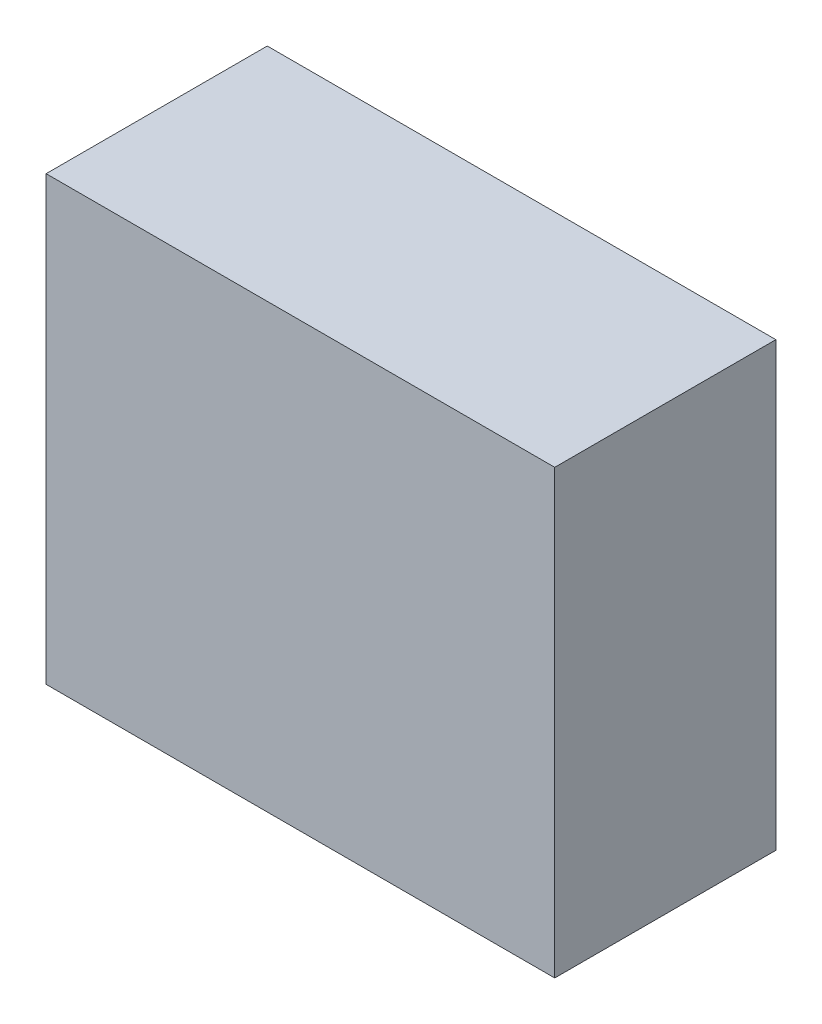
ISO-10303-21;
HEADER;
FILE_DESCRIPTION(('STEP AP214'),'2;1');
FILE_NAME('part.step','',(''),(''),'','','');
FILE_SCHEMA(('AUTOMOTIVE_DESIGN { 1 0 10303 214 1 1 1 1 }'));
ENDSEC;
DATA;
#1=APPLICATION_CONTEXT('core data for automotive mechanical design processes');
#2=APPLICATION_PROTOCOL_DEFINITION('international standard','automotive_design',2000,#1);
#3=PRODUCT_CONTEXT('',#1,'mechanical');
#4=PRODUCT('Part','Part','',(#3));
#5=PRODUCT_RELATED_PRODUCT_CATEGORY('part','',(#4));
#6=PRODUCT_DEFINITION_FORMATION('','',#4);
#7=PRODUCT_DEFINITION_CONTEXT('part definition',#1,'design');
#8=PRODUCT_DEFINITION('design','',#6,#7);
#9=PRODUCT_DEFINITION_SHAPE('','',#8);
#10=(LENGTH_UNIT() NAMED_UNIT(*) SI_UNIT(.MILLI.,.METRE.));
#11=(NAMED_UNIT(*) PLANE_ANGLE_UNIT() SI_UNIT($,.RADIAN.));
#12=(NAMED_UNIT(*) SI_UNIT($,.STERADIAN.) SOLID_ANGLE_UNIT());
#13=UNCERTAINTY_MEASURE_WITH_UNIT(LENGTH_MEASURE(1.E-05),#10,'distance_accuracy_value','');
#14=(GEOMETRIC_REPRESENTATION_CONTEXT(3) GLOBAL_UNCERTAINTY_ASSIGNED_CONTEXT((#13)) GLOBAL_UNIT_ASSIGNED_CONTEXT((#10,
#11,#12)) REPRESENTATION_CONTEXT('',''));
#15=CARTESIAN_POINT('',(0.,0.,0.));
#16=DIRECTION('',(0.,0.,1.));
#17=DIRECTION('',(1.,0.,0.));
#18=AXIS2_PLACEMENT_3D('',#15,#16,#17);
#19=CARTESIAN_POINT('',(0.,0.,-10.));
#20=DIRECTION('',(-1.,0.,0.));
#21=DIRECTION('',(0.,0.,1.));
#22=AXIS2_PLACEMENT_3D('',#19,#20,#21);
#23=PLANE('',#22);
#24=DIRECTION('',(0.,-1.,0.));
#25=VECTOR('',#24,1.);
#26=CARTESIAN_POINT('',(0.,0.,0.));
#27=LINE('',#26,#25);
#28=CARTESIAN_POINT('',(0.,20.,0.));
#29=VERTEX_POINT('',#28);
#30=CARTESIAN_POINT('',(0.,0.,0.));
#31=VERTEX_POINT('',#30);
#32=EDGE_CURVE('E107',#29,#31,#27,.T.);
#33=ORIENTED_EDGE('',*,*,#32,.F.);
#34=DIRECTION('',(0.,0.,1.));
#35=VECTOR('',#34,1.);
#36=CARTESIAN_POINT('',(0.,20.,-10.));
#37=LINE('',#36,#35);
#38=CARTESIAN_POINT('',(0.,20.,-10.));
#39=VERTEX_POINT('',#38);
#40=EDGE_CURVE('E11',#39,#29,#37,.T.);
#41=ORIENTED_EDGE('',*,*,#40,.F.);
#42=DIRECTION('',(0.,-1.,0.));
#43=VECTOR('',#42,1.);
#44=CARTESIAN_POINT('',(0.,0.,-10.));
#45=LINE('',#44,#43);
#46=CARTESIAN_POINT('',(0.,0.,-10.));
#47=VERTEX_POINT('',#46);
#48=EDGE_CURVE('E102',#39,#47,#45,.T.);
#49=ORIENTED_EDGE('',*,*,#48,.T.);
#50=DIRECTION('',(0.,0.,1.));
#51=VECTOR('',#50,1.);
#52=CARTESIAN_POINT('',(0.,0.,-10.));
#53=LINE('',#52,#51);
#54=EDGE_CURVE('E46',#47,#31,#53,.T.);
#55=ORIENTED_EDGE('',*,*,#54,.T.);
#56=EDGE_LOOP('',(#33,#41,#49,#55));
#57=FACE_BOUND('',#56,.T.);
#58=ADVANCED_FACE('F43',(#57),#23,.T.);
#59=CARTESIAN_POINT('',(0.,20.,-10.));
#60=DIRECTION('',(0.,1.,0.));
#61=DIRECTION('',(0.,0.,1.));
#62=AXIS2_PLACEMENT_3D('',#59,#60,#61);
#63=PLANE('',#62);
#64=DIRECTION('',(-1.,0.,0.));
#65=VECTOR('',#64,1.);
#66=CARTESIAN_POINT('',(0.,20.,0.));
#67=LINE('',#66,#65);
#68=CARTESIAN_POINT('',(23.,20.,0.));
#69=VERTEX_POINT('',#68);
#70=EDGE_CURVE('E104',#69,#29,#67,.T.);
#71=ORIENTED_EDGE('',*,*,#70,.F.);
#72=DIRECTION('',(0.,0.,1.));
#73=VECTOR('',#72,1.);
#74=CARTESIAN_POINT('',(23.,20.,-10.));
#75=LINE('',#74,#73);
#76=CARTESIAN_POINT('',(23.,20.,-10.));
#77=VERTEX_POINT('',#76);
#78=EDGE_CURVE('E55',#77,#69,#75,.T.);
#79=ORIENTED_EDGE('',*,*,#78,.F.);
#80=DIRECTION('',(-1.,0.,0.));
#81=VECTOR('',#80,1.);
#82=CARTESIAN_POINT('',(0.,20.,-10.));
#83=LINE('',#82,#81);
#84=EDGE_CURVE('E97',#77,#39,#83,.T.);
#85=ORIENTED_EDGE('',*,*,#84,.T.);
#86=ORIENTED_EDGE('',*,*,#40,.T.);
#87=EDGE_LOOP('',(#71,#79,#85,#86));
#88=FACE_BOUND('',#87,.T.);
#89=ADVANCED_FACE('F117',(#88),#63,.T.);
#90=CARTESIAN_POINT('',(23.,0.,-10.));
#91=DIRECTION('',(1.,0.,0.));
#92=DIRECTION('',(0.,0.,-1.));
#93=AXIS2_PLACEMENT_3D('',#90,#91,#92);
#94=PLANE('',#93);
#95=DIRECTION('',(0.,1.,0.));
#96=VECTOR('',#95,1.);
#97=CARTESIAN_POINT('',(23.,0.,0.));
#98=LINE('',#97,#96);
#99=CARTESIAN_POINT('',(23.,0.,0.));
#100=VERTEX_POINT('',#99);
#101=EDGE_CURVE('E93',#100,#69,#98,.T.);
#102=ORIENTED_EDGE('',*,*,#101,.F.);
#103=DIRECTION('',(0.,0.,1.));
#104=VECTOR('',#103,1.);
#105=CARTESIAN_POINT('',(23.,0.,-10.));
#106=LINE('',#105,#104);
#107=CARTESIAN_POINT('',(23.,0.,-10.));
#108=VERTEX_POINT('',#107);
#109=EDGE_CURVE('E88',#108,#100,#106,.T.);
#110=ORIENTED_EDGE('',*,*,#109,.F.);
#111=DIRECTION('',(0.,1.,0.));
#112=VECTOR('',#111,1.);
#113=CARTESIAN_POINT('',(23.,0.,-10.));
#114=LINE('',#113,#112);
#115=EDGE_CURVE('E91',#108,#77,#114,.T.);
#116=ORIENTED_EDGE('',*,*,#115,.T.);
#117=ORIENTED_EDGE('',*,*,#78,.T.);
#118=EDGE_LOOP('',(#102,#110,#116,#117));
#119=FACE_BOUND('',#118,.T.);
#120=ADVANCED_FACE('F89',(#119),#94,.T.);
#121=CARTESIAN_POINT('',(0.,0.,-10.));
#122=DIRECTION('',(0.,-1.,0.));
#123=DIRECTION('',(0.,0.,-1.));
#124=AXIS2_PLACEMENT_3D('',#121,#122,#123);
#125=PLANE('',#124);
#126=DIRECTION('',(1.,0.,0.));
#127=VECTOR('',#126,1.);
#128=CARTESIAN_POINT('',(0.,0.,0.));
#129=LINE('',#128,#127);
#130=EDGE_CURVE('E110',#31,#100,#129,.T.);
#131=ORIENTED_EDGE('',*,*,#130,.F.);
#132=ORIENTED_EDGE('',*,*,#54,.F.);
#133=DIRECTION('',(1.,0.,0.));
#134=VECTOR('',#133,1.);
#135=CARTESIAN_POINT('',(0.,0.,-10.));
#136=LINE('',#135,#134);
#137=EDGE_CURVE('E100',#47,#108,#136,.T.);
#138=ORIENTED_EDGE('',*,*,#137,.T.);
#139=ORIENTED_EDGE('',*,*,#109,.T.);
#140=EDGE_LOOP('',(#131,#132,#138,#139));
#141=FACE_BOUND('',#140,.T.);
#142=ADVANCED_FACE('F99',(#141),#125,.T.);
#143=CARTESIAN_POINT('',(0.,0.,-10.));
#144=DIRECTION('',(0.,0.,-1.));
#145=DIRECTION('',(-1.,0.,0.));
#146=AXIS2_PLACEMENT_3D('',#143,#144,#145);
#147=PLANE('',#146);
#148=ORIENTED_EDGE('',*,*,#48,.F.);
#149=ORIENTED_EDGE('',*,*,#84,.F.);
#150=ORIENTED_EDGE('',*,*,#115,.F.);
#151=ORIENTED_EDGE('',*,*,#137,.F.);
#152=EDGE_LOOP('',(#148,#149,#150,#151));
#153=FACE_BOUND('',#152,.T.);
#154=ADVANCED_FACE('F96',(#153),#147,.T.);
#155=CARTESIAN_POINT('',(0.,0.,0.));
#156=DIRECTION('',(0.,0.,-1.));
#157=DIRECTION('',(-1.,0.,0.));
#158=AXIS2_PLACEMENT_3D('',#155,#156,#157);
#159=PLANE('',#158);
#160=ORIENTED_EDGE('',*,*,#32,.T.);
#161=ORIENTED_EDGE('',*,*,#130,.T.);
#162=ORIENTED_EDGE('',*,*,#101,.T.);
#163=ORIENTED_EDGE('',*,*,#70,.T.);
#164=EDGE_LOOP('',(#160,#161,#162,#163));
#165=FACE_BOUND('',#164,.T.);
#166=ADVANCED_FACE('F116',(#165),#159,.F.);
#167=CLOSED_SHELL('',(#58,#89,#120,#142,#154,#166));
#168=MANIFOLD_SOLID_BREP('B2',#167);
#169=ADVANCED_BREP_SHAPE_REPRESENTATION('',(#18,#168),#14);
#170=SHAPE_DEFINITION_REPRESENTATION(#9,#169);
ENDSEC;
END-ISO-10303-21;
